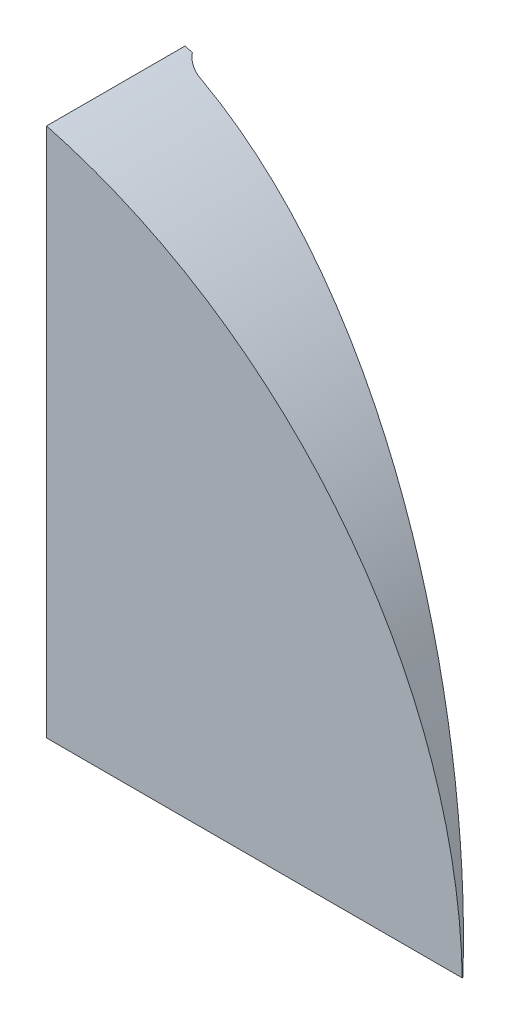
ISO-10303-21;
HEADER;
FILE_DESCRIPTION(('STEP AP214'),'2;1');
FILE_NAME('part.step','',(''),(''),'','','');
FILE_SCHEMA(('AUTOMOTIVE_DESIGN { 1 0 10303 214 1 1 1 1 }'));
ENDSEC;
DATA;
#1=APPLICATION_CONTEXT('core data for automotive mechanical design processes');
#2=APPLICATION_PROTOCOL_DEFINITION('international standard','automotive_design',2000,#1);
#3=PRODUCT_CONTEXT('',#1,'mechanical');
#4=PRODUCT('Part','Part','',(#3));
#5=PRODUCT_RELATED_PRODUCT_CATEGORY('part','',(#4));
#6=PRODUCT_DEFINITION_FORMATION('','',#4);
#7=PRODUCT_DEFINITION_CONTEXT('part definition',#1,'design');
#8=PRODUCT_DEFINITION('design','',#6,#7);
#9=PRODUCT_DEFINITION_SHAPE('','',#8);
#10=(LENGTH_UNIT() NAMED_UNIT(*) SI_UNIT(.MILLI.,.METRE.));
#11=(NAMED_UNIT(*) PLANE_ANGLE_UNIT() SI_UNIT($,.RADIAN.));
#12=(NAMED_UNIT(*) SI_UNIT($,.STERADIAN.) SOLID_ANGLE_UNIT());
#13=UNCERTAINTY_MEASURE_WITH_UNIT(LENGTH_MEASURE(1.E-05),#10,'distance_accuracy_value','');
#14=(GEOMETRIC_REPRESENTATION_CONTEXT(3) GLOBAL_UNCERTAINTY_ASSIGNED_CONTEXT((#13)) GLOBAL_UNIT_ASSIGNED_CONTEXT((#10,
#11,#12)) REPRESENTATION_CONTEXT('',''));
#15=CARTESIAN_POINT('',(0.,0.,0.));
#16=DIRECTION('',(0.,0.,1.));
#17=DIRECTION('',(1.,0.,0.));
#18=AXIS2_PLACEMENT_3D('',#15,#16,#17);
#19=CARTESIAN_POINT('',(7.5,0.,0.));
#20=DIRECTION('',(1.,0.,0.));
#21=DIRECTION('',(0.,0.,-1.));
#22=AXIS2_PLACEMENT_3D('',#19,#20,#21);
#23=PLANE('',#22);
#24=CARTESIAN_POINT('',(7.5,24.6269825229069,-24.4905503395669));
#25=CARTESIAN_POINT('',(7.49999999999999,25.4752306602531,-22.679342152337));
#26=CARTESIAN_POINT('',(9.49999999999999,25.4752306602531,-22.679342152337));
#27=CARTESIAN_POINT('',(7.5,23.727970498854,-24.0695135531755));
#28=CARTESIAN_POINT('',(7.49999999999999,24.5762186362002,-22.2583053659455));
#29=CARTESIAN_POINT('',(9.49999999999999,24.5762186362463,-22.258305365847));
#30=CARTESIAN_POINT('',(7.5,22.828958474801,-23.648476766784));
#31=CARTESIAN_POINT('',(7.49999999999999,23.6772066121472,-21.8372685795541));
#32=CARTESIAN_POINT('',(9.49999999999999,23.6772066122395,-21.837268579357));
#33=CARTESIAN_POINT('',(7.5,21.030934426695,-22.8064031940011));
#34=CARTESIAN_POINT('',(7.5,21.8791825640412,-20.9951950067712));
#35=CARTESIAN_POINT('',(9.49999999999999,21.8791825642258,-20.9951950063771));
#36=CARTESIAN_POINT('',(7.5,20.131922402642,-22.3853664076097));
#37=CARTESIAN_POINT('',(7.5,20.9801705399882,-20.5741582203798));
#38=CARTESIAN_POINT('',(9.49999999999999,20.980170540219,-20.5741582198871));
#39=CARTESIAN_POINT('',(7.5,19.2329103785891,-21.9643296212182));
#40=CARTESIAN_POINT('',(7.5,20.0811585159353,-20.1531214339883));
#41=CARTESIAN_POINT('',(9.49999999999999,20.0811585162121,-20.1531214333971));
#42=CARTESIAN_POINT('',(7.5,18.0490987270486,-21.409875517916));
#43=CARTESIAN_POINT('',(7.50000000000001,18.8757670199999,-19.5885584428168));
#44=CARTESIAN_POINT('',(9.49999999999999,18.8757670201004,-19.5885584426021));
#45=CARTESIAN_POINT('',(7.5,16.8553948942699,-20.8766633945285));
#46=CARTESIAN_POINT('',(7.5,17.6601045828467,-19.0455351028039));
#47=CARTESIAN_POINT('',(9.49999999999999,17.6601045828739,-19.0455351027459));
#48=CARTESIAN_POINT('',(7.5,14.4513778760624,-19.8547562465258));
#49=CARTESIAN_POINT('',(7.5,15.2115471749926,-18.0046953604924));
#50=CARTESIAN_POINT('',(9.49999999999999,15.2115471749654,-18.0046953605503));
#51=CARTESIAN_POINT('',(7.5,13.2410948578095,-19.3659902377444));
#52=CARTESIAN_POINT('',(7.49999999999999,13.9786834429632,-17.5068068781489));
#53=CARTESIAN_POINT('',(9.49999999999999,13.9786834429549,-17.5068068781666));
#54=CARTESIAN_POINT('',(7.5,10.3045322421882,-18.2423793633746));
#55=CARTESIAN_POINT('',(7.49999999999999,10.9870467312342,-16.3621233161698));
#56=CARTESIAN_POINT('',(9.49999999999999,10.9870467312459,-16.3621233161449));
#57=CARTESIAN_POINT('',(7.5,8.56973038793027,-17.6295832268934));
#58=CARTESIAN_POINT('',(7.5,9.21947567489382,-15.7377470520919));
#59=CARTESIAN_POINT('',(9.49999999999999,9.21947567489616,-15.7377470520869));
#60=CARTESIAN_POINT('',(7.5,5.9434789302502,-16.7784466367455));
#61=CARTESIAN_POINT('',(7.5,6.54345945029859,-14.8704819953038));
#62=CARTESIAN_POINT('',(9.49999999999999,6.54345945029742,-14.8704819953063));
#63=CARTESIAN_POINT('',(7.5,5.06299082120875,-16.5057934236718));
#64=CARTESIAN_POINT('',(7.5,5.64626099467511,-14.5926541618828));
#65=CARTESIAN_POINT('',(9.49999999999999,5.64626099467452,-14.592654161884));
#66=CARTESIAN_POINT('',(7.5,3.29517760896637,-15.9836900650106));
#67=CARTESIAN_POINT('',(7.5,3.84488052735341,-14.0606369472226));
#68=CARTESIAN_POINT('',(9.49999999999999,3.84488052735399,-14.0606369472213));
#69=CARTESIAN_POINT('',(7.5,2.4078526172603,-15.7342395419007));
#70=CARTESIAN_POINT('',(7.5,2.94069862953954,-13.8064471813771));
#71=CARTESIAN_POINT('',(9.49999999999999,2.94069862954071,-13.8064471813746));
#72=CARTESIAN_POINT('',(7.5,1.5173535307439,-15.4964767677445));
#73=CARTESIAN_POINT('',(7.49999999999999,2.03329148356876,-13.5641703663591));
#74=CARTESIAN_POINT('',(9.49999999999999,2.03329148356876,-13.5641703663591));
#75=(BOUNDED_SURFACE() B_SPLINE_SURFACE(3,2,((#24,#25,#26),(#27,#28,#29),(#30,#31,#32),(#33,#34,
#35),(#36,#37,#38),(#39,#40,#41),(#42,#43,#44),(#45,#46,#47),(#48,#49,#50),(#51,#52,#53),(#54,
#55,#56),(#57,#58,#59),(#60,#61,#62),(#63,#64,#65),(#66,#67,#68),(#69,#70,#71),(#72,#73,#74)),
.UNSPECIFIED.,.F.,.F.,.F.) B_SPLINE_SURFACE_WITH_KNOTS((4,2,3,2,2,2,2,4),(3,3),(0.,
2.97816241229051,5.95632482458102,9.87766521898863,13.7926286789041,19.3093322650314,
22.0742767603028,24.8391762603108),(0.,1.),
.UNSPECIFIED.) GEOMETRIC_REPRESENTATION_ITEM() RATIONAL_B_SPLINE_SURFACE(((1.,0.707106781186547,
1.),(1.,0.707106781186547,1.),(1.,0.707106781186547,1.),(1.,0.707106781186548,1.),(1.,
0.707106781186548,1.),(1.,0.707106781186548,1.),(1.,0.70710678118655,1.),(1.,0.707106781186549,
1.),(1.,0.707106781186548,1.),(1.,0.707106781186547,1.),(1.,0.707106781186546,1.),(1.,
0.707106781186548,1.),(1.,0.707106781186549,1.),(1.,0.707106781186549,1.),(1.,0.707106781186548,
1.),(1.,0.707106781186548,1.),(1.,0.707106781186547,1.))) REPRESENTATION_ITEM('') SURFACE());
#76=CARTESIAN_POINT('',(7.5,24.6269825229069,-24.4905503395669));
#77=CARTESIAN_POINT('',(7.5,23.727970498854,-24.0695135531755));
#78=CARTESIAN_POINT('',(7.5,22.828958474801,-23.648476766784));
#79=CARTESIAN_POINT('',(7.5,21.030934426695,-22.8064031940011));
#80=CARTESIAN_POINT('',(7.5,20.131922402642,-22.3853664076097));
#81=CARTESIAN_POINT('',(7.5,19.2329103785891,-21.9643296212182));
#82=CARTESIAN_POINT('',(7.5,18.0490987270486,-21.409875517916));
#83=CARTESIAN_POINT('',(7.5,16.8553948942699,-20.8766633945285));
#84=CARTESIAN_POINT('',(7.5,14.4513778760624,-19.8547562465258));
#85=CARTESIAN_POINT('',(7.5,13.2410948578095,-19.3659902377444));
#86=CARTESIAN_POINT('',(7.5,10.3045322421882,-18.2423793633746));
#87=CARTESIAN_POINT('',(7.5,8.56973038793027,-17.6295832268934));
#88=CARTESIAN_POINT('',(7.5,5.9434789302502,-16.7784466367455));
#89=CARTESIAN_POINT('',(7.5,5.06299082120875,-16.5057934236718));
#90=CARTESIAN_POINT('',(7.5,3.29517760896637,-15.9836900650106));
#91=CARTESIAN_POINT('',(7.5,2.4078526172603,-15.7342395419007));
#92=CARTESIAN_POINT('',(7.5,1.5173535307439,-15.4964767677445));
#93=B_SPLINE_CURVE_WITH_KNOTS('',3,(#76,#77,#78,#79,#80,#81,#82,#83,#84,#85,#86,#87,#88,#89,#90,
#91,#92),.UNSPECIFIED.,.F.,.F.,(4,2,3,2,2,2,2,4),(0.,2.97816241229051,5.95632482458102,
9.87766521898863,13.7926286789041,19.3093322650314,22.0742767603028,24.8391762603108),.UNSPECIFIED.);
#94=CARTESIAN_POINT('',(7.5,15.1653512938994,-20.1596586906036));
#95=VERTEX_POINT('',#94);
#96=CARTESIAN_POINT('',(7.5,5.6275464071145,-16.6838640231835));
#97=VERTEX_POINT('',#96);
#98=EDGE_CURVE('E11',#95,#97,#93,.T.);
#99=ORIENTED_EDGE('',*,*,#98,.T.);
#100=CARTESIAN_POINT('',(7.5,-20.4999999999999,0.));
#101=DIRECTION('',(1.,0.,0.));
#102=DIRECTION('',(0.,0.,-1.));
#103=AXIS2_PLACEMENT_3D('',#100,#101,#102);
#104=CIRCLE('',#103,30.9999999999999);
#105=CARTESIAN_POINT('',(7.50000000000001,6.20385889532149,-15.7449649125922));
#106=VERTEX_POINT('',#105);
#107=EDGE_CURVE('E227',#106,#97,#104,.F.);
#108=ORIENTED_EDGE('',*,*,#107,.F.);
#109=CARTESIAN_POINT('',(7.50000000000002,-20.9157926242046,-10.));
#110=CARTESIAN_POINT('',(7.50000000000002,0.108501165267456,-13.0562085018914));
#111=CARTESIAN_POINT('',(7.50000000000001,20.0842073757953,-20.1531214173485));
#112=B_SPLINE_CURVE_WITH_KNOTS('',2,(#109,#110,#111),.UNSPECIFIED.,.F.,.F.,(3,3),(0.,1.),.UNSPECIFIED.);
#113=CARTESIAN_POINT('',(7.49999999999999,-20.1657926242046,-10.1103593750755));
#114=VERTEX_POINT('',#113);
#115=EDGE_CURVE('E47',#106,#114,#112,.F.);
#116=ORIENTED_EDGE('',*,*,#115,.T.);
#117=DIRECTION('',(0.,0.,-1.));
#118=VECTOR('',#117,1.);
#119=CARTESIAN_POINT('',(7.5,-20.1657926242046,-24.));
#120=LINE('',#119,#118);
#121=CARTESIAN_POINT('',(7.5,-20.1657926242046,-10.));
#122=VERTEX_POINT('',#121);
#123=EDGE_CURVE('E130',#122,#114,#120,.T.);
#124=ORIENTED_EDGE('',*,*,#123,.F.);
#125=DIRECTION('',(0.,-1.,0.));
#126=VECTOR('',#125,1.);
#127=CARTESIAN_POINT('',(7.5,0.,-10.));
#128=LINE('',#127,#126);
#129=CARTESIAN_POINT('',(7.5,18.716895904332,-10.));
#130=VERTEX_POINT('',#129);
#131=EDGE_CURVE('E234',#130,#122,#128,.T.);
#132=ORIENTED_EDGE('',*,*,#131,.F.);
#133=DIRECTION('',(0.,0.,-1.));
#134=VECTOR('',#133,1.);
#135=CARTESIAN_POINT('',(7.5,18.716895904332,0.));
#136=LINE('',#135,#134);
#137=CARTESIAN_POINT('',(7.5,18.7168959043316,-20.1531214173485));
#138=VERTEX_POINT('',#137);
#139=EDGE_CURVE('E233',#138,#130,#136,.F.);
#140=ORIENTED_EDGE('',*,*,#139,.F.);
#141=DIRECTION('',(0.,-1.,0.));
#142=VECTOR('',#141,1.);
#143=CARTESIAN_POINT('',(7.5,-20.9157926242048,-20.1531214173485));
#144=LINE('',#143,#142);
#145=CARTESIAN_POINT('',(7.5,15.2050654268776,-20.1531214173485));
#146=VERTEX_POINT('',#145);
#147=EDGE_CURVE('E226',#138,#146,#144,.T.);
#148=ORIENTED_EDGE('',*,*,#147,.T.);
#149=CARTESIAN_POINT('',(7.5,12.8789441662329,-19.7809526147633));
#150=CARTESIAN_POINT('',(7.5,13.248858139662,-19.9729817315801));
#151=CARTESIAN_POINT('',(7.5,13.983479697962,-20.3543372335831));
#152=CARTESIAN_POINT('',(7.5,14.799798647885,-20.219875705482));
#153=CARTESIAN_POINT('',(7.5,15.2050654268776,-20.1531214173485));
#154=B_SPLINE_CURVE_WITH_KNOTS('',3,(#149,#150,#151,#152,#153),.UNSPECIFIED.,.F.,.F.,(4,1,4),
(0.,0.503543585468801,1.),.UNSPECIFIED.);
#155=EDGE_CURVE('E40',#95,#146,#154,.T.);
#156=ORIENTED_EDGE('',*,*,#155,.F.);
#157=EDGE_LOOP('',(#99,#108,#116,#124,#132,#140,#148,#156));
#158=FACE_BOUND('',#157,.T.);
#159=ADVANCED_FACE('F37',(#158),#23,.F.);
#160=CARTESIAN_POINT('',(7.55577683371129,6.63099621654525,-16.5088194571331));
#161=CARTESIAN_POINT('',(7.57033259388141,6.62541728951922,-16.4436923329377));
#162=CARTESIAN_POINT('',(7.58760420781254,6.61878697766647,-16.3793160570922));
#163=CARTESIAN_POINT('',(7.62730942988323,6.60348721486283,-16.2524364228923));
#164=CARTESIAN_POINT('',(7.64974202537131,6.59481816393156,-16.1899326998345));
#165=CARTESIAN_POINT('',(7.72406400789847,6.56596980605252,-16.0065462460896));
#166=CARTESIAN_POINT('',(7.78317389278291,6.54287507883383,-15.8889335726621));
#167=CARTESIAN_POINT('',(7.89136617376938,6.50007972206728,-15.7098338432503));
#168=CARTESIAN_POINT('',(7.93519865452009,6.48263698099535,-15.6445158070028));
#169=CARTESIAN_POINT('',(8.02844768451344,6.44523576200538,-15.5186718472794));
#170=CARTESIAN_POINT('',(8.07786891760349,6.42527517227525,-15.4581500167587));
#171=CARTESIAN_POINT('',(8.22251761956444,6.36634584677148,-15.2969965263947));
#172=CARTESIAN_POINT('',(8.32325511981062,6.32475331792333,-15.2021620784517));
#173=CARTESIAN_POINT('',(8.5374777924491,6.23471668099388,-15.0319218828541));
#174=CARTESIAN_POINT('',(8.65098167545028,6.18626248870625,-14.956545199853));
#175=CARTESIAN_POINT('',(8.88434164094845,6.08472683047693,-14.8290982172099));
#176=CARTESIAN_POINT('',(9.00396762176808,6.0317915393513,-14.7764917891057));
#177=CARTESIAN_POINT('',(9.24869404880921,5.92145751977753,-14.6937226056227));
#178=CARTESIAN_POINT('',(9.37379173053608,5.86406103414679,-14.6635486521445));
#179=CARTESIAN_POINT('',(9.50000000000017,5.80498580756965,-14.645475676483));
#180=B_SPLINE_CURVE_WITH_KNOTS('',3,(#160,#161,#162,#163,#164,#165,#166,#167,#168,#169,#170,
#171,#172,#173,#174,#175,#176,#177,#178,#179),.UNSPECIFIED.,.F.,.F.,(4,2,2,2,2,2,2,2,2,4),(0.,
0.200735949554099,0.401432545653739,0.800219610235882,1.04161468337998,1.28321358671339,
1.71441641454558,2.14625966394889,2.5672940261324,2.98811807017762),.UNSPECIFIED.);
#181=CARTESIAN_POINT('',(7.81581267110756,6.52993921634731,-15.8367277986006));
#182=VERTEX_POINT('',#181);
#183=CARTESIAN_POINT('',(9.49999999999999,5.80498580756934,-14.6454756764829));
#184=VERTEX_POINT('',#183);
#185=EDGE_CURVE('E270',#182,#184,#180,.T.);
#186=ORIENTED_EDGE('',*,*,#185,.F.);
#187=CARTESIAN_POINT('',(7.88800905507462,9.15123534657457,-16.5947206449579));
#188=CARTESIAN_POINT('',(7.87742605412391,8.84333332329652,-16.5035537575234));
#189=CARTESIAN_POINT('',(7.8676533417578,8.53520124763731,-16.4130725441961));
#190=CARTESIAN_POINT('',(7.84957119367692,7.91850450895763,-16.2334905747529));
#191=CARTESIAN_POINT('',(7.84126170364208,7.60993986242458,-16.1443897675035));
#192=CARTESIAN_POINT('',(7.82594796686264,6.99238382767379,-15.9675712905813));
#193=CARTESIAN_POINT('',(7.81894371506109,6.68339244111406,-15.8798536155511));
#194=CARTESIAN_POINT('',(7.80611691675525,6.06498316324514,-15.7058022591459));
#195=CARTESIAN_POINT('',(7.80029441412344,5.75556525653055,-15.6194686292632));
#196=CARTESIAN_POINT('',(7.79500129009292,5.44594627465571,-15.5338308827929));
#197=B_SPLINE_CURVE_WITH_KNOTS('',3,(#187,#188,#189,#190,#191,#192,#193,#194,#195,#196),
.UNSPECIFIED.,.F.,.F.,(4,2,2,2,4),(0.,0.963866066756547,1.92769634379308,2.89152288652779,
3.85538520480947),.UNSPECIFIED.);
#198=CARTESIAN_POINT('',(7.80905726544879,6.2038588953215,-15.7449649125922));
#199=VERTEX_POINT('',#198);
#200=EDGE_CURVE('E116',#182,#199,#197,.T.);
#201=ORIENTED_EDGE('',*,*,#200,.T.);
#202=CARTESIAN_POINT('',(7.5,5.6275464071145,-16.6838640231835));
#203=CARTESIAN_POINT('',(7.50000187348262,5.65933827283921,-16.634078405932));
#204=CARTESIAN_POINT('',(7.5024368850069,5.69097177755135,-16.5842234084507));
#205=CARTESIAN_POINT('',(7.51218345221658,5.75374433492373,-16.4846706141856));
#206=CARTESIAN_POINT('',(7.51949564005495,5.78488332295169,-16.4349728386192));
#207=CARTESIAN_POINT('',(7.54878208481883,5.87734156263239,-16.2864791889875));
#208=CARTESIAN_POINT('',(7.57810626925494,5.9376372916024,-16.1883845352388));
#209=CARTESIAN_POINT('',(7.65582389439488,6.05380462894296,-15.9971259209356));
#210=CARTESIAN_POINT('',(7.70424435167401,6.10966983412079,-15.9039691590394));
#211=CARTESIAN_POINT('',(7.81897214816388,6.21533549024928,-15.7258238771904));
#212=CARTESIAN_POINT('',(7.88523339336739,6.26515109647458,-15.6408150628774));
#213=CARTESIAN_POINT('',(7.98589331187303,6.327719777602,-15.5330144096295));
#214=CARTESIAN_POINT('',(8.01334543225031,6.3436883332864,-15.5053979081086));
#215=CARTESIAN_POINT('',(8.07016086539517,6.37464184627612,-15.4516853323887));
#216=CARTESIAN_POINT('',(8.09952224763529,6.3896277672818,-15.4255877714289));
#217=CARTESIAN_POINT('',(8.12981136386017,6.40411401920969,-15.4002808039777));
#218=B_SPLINE_CURVE_WITH_KNOTS('',3,(#202,#203,#204,#205,#206,#207,#208,#209,#210,#211,#212,
#213,#214,#215,#216,#217),.UNSPECIFIED.,.F.,.F.,(4,2,2,2,2,2,2,4),(0.,0.177106680635311,
0.354236321333857,0.708852491239717,1.06397216680997,1.41818300504829,1.54438061168844,
1.67045254176131),.UNSPECIFIED.);
#219=EDGE_CURVE('E264',#97,#199,#218,.T.);
#220=ORIENTED_EDGE('',*,*,#219,.F.);
#221=ORIENTED_EDGE('',*,*,#98,.F.);
#222=CARTESIAN_POINT('',(7.50011440081169,15.2050654268776,-20.1531214173485));
#223=CARTESIAN_POINT('',(7.50007626586917,15.1984466311255,-20.1542120045492));
#224=CARTESIAN_POINT('',(7.50004766499693,15.1918277221766,-20.1553020709194));
#225=CARTESIAN_POINT('',(7.50000953139293,15.1785896778505,-20.1574811620045));
#226=CARTESIAN_POINT('',(7.49999999866127,15.1719705424734,-20.1585701867193));
#227=CARTESIAN_POINT('',(7.49999999999999,15.1653512938994,-20.1596586906036));
#228=B_SPLINE_CURVE_WITH_KNOTS('',3,(#222,#223,#224,#225,#226,#227),.UNSPECIFIED.,.F.,.F.,(4,2,
4),(0.,0.0201243922984543,0.040248784701385),.UNSPECIFIED.);
#229=CARTESIAN_POINT('',(7.50011440081169,15.2050654268776,-20.1531214173485));
#230=VERTEX_POINT('',#229);
#231=EDGE_CURVE('E212',#230,#95,#228,.T.);
#232=ORIENTED_EDGE('',*,*,#231,.F.);
#233=CARTESIAN_POINT('',(8.04049506676899,18.5697423054458,-20.1531214173485));
#234=CARTESIAN_POINT('',(8.01994712600048,18.5166378824148,-20.1531214173485));
#235=CARTESIAN_POINT('',(8.00023179985125,18.4632182982716,-20.1531214173485));
#236=CARTESIAN_POINT('',(7.96234803967043,18.3558415116817,-20.1531214173485));
#237=CARTESIAN_POINT('',(7.94417937888747,18.3018843893418,-20.1531214173485));
#238=CARTESIAN_POINT('',(7.89183260475811,18.1394007782811,-20.1531214173485));
#239=CARTESIAN_POINT('',(7.85978425220841,18.0301847821005,-20.1531214173485));
#240=CARTESIAN_POINT('',(7.80073350185788,17.8106481608989,-20.1531214173485));
#241=CARTESIAN_POINT('',(7.77372113792452,17.7003301827571,-20.1531214173485));
#242=CARTESIAN_POINT('',(7.72412978006257,17.4786877007268,-20.1531214173485));
#243=CARTESIAN_POINT('',(7.70155166848497,17.3673630011162,-20.1531214173485));
#244=CARTESIAN_POINT('',(7.6402617326359,17.0345953023698,-20.1531214173485));
#245=CARTESIAN_POINT('',(7.60740005949277,16.8120648839304,-20.1531214173485));
#246=CARTESIAN_POINT('',(7.55514760749223,16.365401302421,-20.1531214173485));
#247=CARTESIAN_POINT('',(7.53576124614401,16.1412676380752,-20.1531214173485));
#248=CARTESIAN_POINT('',(7.51893972506301,15.8576386945725,-20.1531214173485));
#249=CARTESIAN_POINT('',(7.51585244406013,15.7984432962667,-20.1531214173485));
#250=CARTESIAN_POINT('',(7.51050773003182,15.6800277782039,-20.1531214173485));
#251=CARTESIAN_POINT('',(7.50825010070863,15.620807667618,-20.1531214173485));
#252=CARTESIAN_POINT('',(7.50454248902379,15.5021817119311,-20.1531214173485));
#253=CARTESIAN_POINT('',(7.50309471536343,15.4427757989695,-20.1531214173485));
#254=CARTESIAN_POINT('',(7.50100379397948,15.3239356141455,-20.1531214173485));
#255=CARTESIAN_POINT('',(7.5003608382332,15.2645013388988,-20.1531214173485));
#256=CARTESIAN_POINT('',(7.50011440081169,15.2050654268776,-20.1531214173485));
#257=B_SPLINE_CURVE_WITH_KNOTS('',3,(#233,#234,#235,#236,#237,#238,#239,#240,#241,#242,#243,
#244,#245,#246,#247,#248,#249,#250,#251,#252,#253,#254,#255,#256),.UNSPECIFIED.,.F.,.F.,(4,2,2,
2,2,2,2,2,2,2,2,4),(0.,0.170806003228662,0.341586921887336,0.68290104085217,1.02353236386615,
1.36423139898102,2.0385387106415,2.71306697122831,2.89089189333217,3.06867471445999,
3.24694006379429,3.4252479275707),.UNSPECIFIED.);
#258=CARTESIAN_POINT('',(8.0404950667689,18.5697423054455,-20.1531214173485));
#259=VERTEX_POINT('',#258);
#260=EDGE_CURVE('E243',#259,#230,#257,.T.);
#261=ORIENTED_EDGE('',*,*,#260,.F.);
#262=CARTESIAN_POINT('',(9.49999999999999,18.132254702139,-19.2631441569409));
#263=CARTESIAN_POINT('',(9.43950042789879,18.1516231315075,-19.2717493775103));
#264=CARTESIAN_POINT('',(9.37934998613328,18.1707220133504,-19.283261495485));
#265=CARTESIAN_POINT('',(9.26019995108919,18.2082583859044,-19.3117989846479));
#266=CARTESIAN_POINT('',(9.2011996832704,18.2266962699401,-19.3288210145995));
#267=CARTESIAN_POINT('',(9.08487580355155,18.2627663390821,-19.368039194384));
#268=CARTESIAN_POINT('',(9.02754832432989,18.2804004461577,-19.3902221331441));
#269=CARTESIAN_POINT('',(8.91478902407236,18.3148240218611,-19.4394940652374));
#270=CARTESIAN_POINT('',(8.85935744216517,18.3316133840667,-19.4665836747539));
#271=CARTESIAN_POINT('',(8.6966453203524,18.3805336591655,-19.5546031572));
#272=CARTESIAN_POINT('',(8.5925982739253,18.4113246644565,-19.6224037274764));
#273=CARTESIAN_POINT('',(8.39569179585241,18.4688333007094,-19.7739258704215));
#274=CARTESIAN_POINT('',(8.30282723254306,18.4955528015985,-19.8576400944521));
#275=CARTESIAN_POINT('',(8.18539503721845,18.5289533494628,-19.9805530287127));
#276=CARTESIAN_POINT('',(8.15514375349753,18.5375177634184,-20.0139658750249));
#277=CARTESIAN_POINT('',(8.09645977947484,18.554063043695,-20.0823683574715));
#278=CARTESIAN_POINT('',(8.0680235242475,18.5620450586267,-20.1173546572092));
#279=CARTESIAN_POINT('',(8.04049506676899,18.5697423054458,-20.1531214173485));
#280=B_SPLINE_CURVE_WITH_KNOTS('',3,(#262,#263,#264,#265,#266,#267,#268,#269,#270,#271,#272,
#273,#274,#275,#276,#277,#278,#279),.UNSPECIFIED.,.F.,.F.,(4,2,2,2,2,2,2,2,4),(0.,
0.192215544037456,0.384314745347083,0.575927512308526,0.767564358840175,1.14969794953648,
1.53165550462567,1.6692428942272,1.80655115639835),.UNSPECIFIED.);
#281=CARTESIAN_POINT('',(9.50000000000251,18.1322547021334,-19.2631441569384));
#282=VERTEX_POINT('',#281);
#283=EDGE_CURVE('E279',#282,#259,#280,.T.);
#284=ORIENTED_EDGE('',*,*,#283,.F.);
#285=CARTESIAN_POINT('',(9.49999999999999,2.03329148356876,-13.5641703663591));
#286=CARTESIAN_POINT('',(9.49999999999999,2.94069862954071,-13.8064471813746));
#287=CARTESIAN_POINT('',(9.49999999999999,3.84488052735399,-14.0606369472213));
#288=CARTESIAN_POINT('',(9.49999999999999,5.64626099467452,-14.592654161884));
#289=CARTESIAN_POINT('',(9.49999999999999,6.54345945029742,-14.8704819953063));
#290=CARTESIAN_POINT('',(9.49999999999999,9.21947567489616,-15.7377470520869));
#291=CARTESIAN_POINT('',(9.49999999999999,10.9870467312459,-16.3621233161449));
#292=CARTESIAN_POINT('',(9.49999999999999,13.9786834429549,-17.5068068781666));
#293=CARTESIAN_POINT('',(9.49999999999999,15.2115471749654,-18.0046953605503));
#294=CARTESIAN_POINT('',(9.49999999999999,17.6601045828739,-19.0455351027459));
#295=CARTESIAN_POINT('',(9.49999999999999,18.8757670201004,-19.5885584426021));
#296=CARTESIAN_POINT('',(9.49999999999999,20.0811585162121,-20.1531214333971));
#297=CARTESIAN_POINT('',(9.49999999999999,20.980170540219,-20.5741582198871));
#298=CARTESIAN_POINT('',(9.49999999999999,21.8791825642258,-20.9951950063771));
#299=CARTESIAN_POINT('',(9.49999999999999,23.6772066122395,-21.837268579357));
#300=CARTESIAN_POINT('',(9.49999999999999,24.5762186362463,-22.258305365847));
#301=CARTESIAN_POINT('',(9.49999999999999,25.4752306602531,-22.679342152337));
#302=B_SPLINE_CURVE_WITH_KNOTS('',3,(#285,#286,#287,#288,#289,#290,#291,#292,#293,#294,#295,
#296,#297,#298,#299,#300,#301),.UNSPECIFIED.,.F.,.F.,(4,2,2,2,2,3,2,4),(0.,2.764899500008,
5.5298439952794,11.0465475814067,14.9615110413222,18.8828514357298,21.8610138480203,
24.8391762603108),.UNSPECIFIED.);
#303=EDGE_CURVE('E271',#184,#282,#302,.T.);
#304=ORIENTED_EDGE('',*,*,#303,.F.);
#305=EDGE_LOOP('',(#186,#201,#220,#221,#232,#261,#284,#304));
#306=FACE_BOUND('',#305,.T.);
#307=ADVANCED_FACE('F145',(#306),#75,.F.);
#308=CARTESIAN_POINT('',(0.,0.,-10.));
#309=DIRECTION('',(0.,0.,-1.));
#310=DIRECTION('',(-1.,0.,0.));
#311=AXIS2_PLACEMENT_3D('',#308,#309,#310);
#312=PLANE('',#311);
#313=CARTESIAN_POINT('',(-3.00000000000002,-20.9157926242046,-10.));
#314=DIRECTION('',(0.,0.,1.));
#315=DIRECTION('',(1.,0.,0.));
#316=AXIS2_PLACEMENT_3D('',#313,#314,#315);
#317=CIRCLE('',#316,41.);
#318=CARTESIAN_POINT('',(37.9931396699498,-20.1657926242046,-10.));
#319=VERTEX_POINT('',#318);
#320=EDGE_CURVE('E219',#319,#130,#317,.T.);
#321=ORIENTED_EDGE('',*,*,#320,.T.);
#322=ORIENTED_EDGE('',*,*,#131,.T.);
#323=DIRECTION('',(-1.,0.,0.));
#324=VECTOR('',#323,1.);
#325=CARTESIAN_POINT('',(-44.,-20.1657926242046,-10.));
#326=LINE('',#325,#324);
#327=EDGE_CURVE('E218',#319,#122,#326,.T.);
#328=ORIENTED_EDGE('',*,*,#327,.F.);
#329=EDGE_LOOP('',(#321,#322,#328));
#330=FACE_BOUND('',#329,.T.);
#331=ADVANCED_FACE('F158',(#330),#312,.F.);
#332=CARTESIAN_POINT('',(-3.00000000000002,-20.9157926242046,0.));
#333=DIRECTION('',(0.,0.,-1.));
#334=DIRECTION('',(-1.,0.,0.));
#335=AXIS2_PLACEMENT_3D('',#332,#333,#334);
#336=CYLINDRICAL_SURFACE('',#335,41.);
#337=CARTESIAN_POINT('',(-3.00000000000014,-20.9157926242048,-20.1531214173485));
#338=DIRECTION('',(0.,0.,-1.));
#339=DIRECTION('',(-1.,0.,0.));
#340=AXIS2_PLACEMENT_3D('',#337,#338,#339);
#341=CIRCLE('',#340,40.9999999999998);
#342=EDGE_CURVE('E168',#138,#259,#341,.T.);
#343=ORIENTED_EDGE('',*,*,#342,.F.);
#344=ORIENTED_EDGE('',*,*,#139,.T.);
#345=ORIENTED_EDGE('',*,*,#320,.F.);
#346=DIRECTION('',(0.,0.,1.));
#347=VECTOR('',#346,1.);
#348=CARTESIAN_POINT('',(37.9931396699498,-20.1657926242046,-10.0399141139674));
#349=LINE('',#348,#347);
#350=CARTESIAN_POINT('',(37.9931396699498,-20.1657926242046,-10.0399141139674));
#351=VERTEX_POINT('',#350);
#352=EDGE_CURVE('E291',#351,#319,#349,.T.);
#353=ORIENTED_EDGE('',*,*,#352,.F.);
#354=CARTESIAN_POINT('',(7.49999999999959,18.7168959043338,-19.5253640146458));
#355=CARTESIAN_POINT('',(8.05905859911408,18.5687918384543,-19.4584299281652));
#356=CARTESIAN_POINT('',(8.61440926213877,18.40899321433,-19.3865873145693));
#357=CARTESIAN_POINT('',(9.71668215724056,18.0664965073405,-19.2337287085065));
#358=CARTESIAN_POINT('',(10.2636049843622,17.8838000495649,-19.1527133670795));
#359=CARTESIAN_POINT('',(11.3477960864091,17.4960810200852,-18.982189411121));
#360=CARTESIAN_POINT('',(11.8850694209471,17.2910705717654,-18.8926854119179));
#361=CARTESIAN_POINT('',(12.9493325928658,16.8591818283985,-18.705858088666));
#362=CARTESIAN_POINT('',(13.476322260822,16.6323031734352,-18.6085346359258));
#363=CARTESIAN_POINT('',(15.0378763908757,15.9208831267647,-18.3064480493005));
#364=CARTESIAN_POINT('',(16.0560979519725,15.4044563849507,-18.0910788164902));
#365=CARTESIAN_POINT('',(18.0422480097381,14.2910347175806,-17.6382527614746));
#366=CARTESIAN_POINT('',(19.0101699248327,13.6940292850984,-17.4007930600758));
#367=CARTESIAN_POINT('',(20.8886834166446,12.4250680761058,-16.9106268712747));
#368=CARTESIAN_POINT('',(21.7993801816428,11.753256507628,-16.6579501362128));
#369=CARTESIAN_POINT('',(23.5605803331259,10.3381936531032,-16.1433478959539));
#370=CARTESIAN_POINT('',(24.4110856559552,9.59494466699653,-15.8814226886847));
#371=CARTESIAN_POINT('',(26.0481412890883,8.04073581827492,-15.3544065031198));
#372=CARTESIAN_POINT('',(26.8346368330483,7.2297191516946,-15.0893130318944));
#373=CARTESIAN_POINT('',(28.3385927897637,5.54488551916604,-14.5623068584502));
#374=CARTESIAN_POINT('',(29.0560512363967,4.67106676590106,-14.3003942470053));
#375=CARTESIAN_POINT('',(30.2110941354966,3.1392345304235,-13.8637287902076));
#376=CARTESIAN_POINT('',(30.6676077563762,2.49606358403129,-13.6866140917671));
#377=CARTESIAN_POINT('',(31.5435502453831,1.18320618095486,-13.3386987900338));
#378=CARTESIAN_POINT('',(31.9629777345089,0.513518739627375,-13.1678984216688));
#379=CARTESIAN_POINT('',(32.7632556147354,-0.8505270383478,-12.8344404449951));
#380=CARTESIAN_POINT('',(33.1441040238095,-1.54488664007162,-12.6717832552647));
#381=CARTESIAN_POINT('',(33.865416863623,-2.95561423560265,-12.3564760954034));
#382=CARTESIAN_POINT('',(34.2059199534181,-3.67196031928222,-12.2038166092213));
#383=CARTESIAN_POINT('',(34.8455491613424,-5.12514319085298,-11.9099119388273));
#384=CARTESIAN_POINT('',(35.1446770007987,-5.86197912477596,-11.7686662798697));
#385=CARTESIAN_POINT('',(35.7002006917872,-7.35379279528276,-11.4990163212285));
#386=CARTESIAN_POINT('',(35.9566026191659,-8.10876793487633,-11.3706101967368));
#387=CARTESIAN_POINT('',(36.389200919971,-9.51640739294461,-11.1466399205825));
#388=CARTESIAN_POINT('',(36.5716688436318,-10.1668332960741,-11.0490680255011));
#389=CARTESIAN_POINT('',(36.9045277016928,-11.4772760649721,-10.8646125701235));
#390=CARTESIAN_POINT('',(37.0549222226127,-12.137291849553,-10.7777278152277));
#391=CARTESIAN_POINT('',(37.3230444934532,-13.4652309923316,-10.6151704140922));
#392=CARTESIAN_POINT('',(37.4407751274816,-14.1331536469466,-10.5394967782248));
#393=CARTESIAN_POINT('',(37.6432886153552,-15.4765410412121,-10.3996163911124));
#394=CARTESIAN_POINT('',(37.7280056381664,-16.1520181151307,-10.3354326877627));
#395=CARTESIAN_POINT('',(37.8637625488331,-17.5074582198792,-10.218998081787));
#396=CARTESIAN_POINT('',(37.9147982869702,-18.1874217930509,-10.1667486500468));
#397=CARTESIAN_POINT('',(37.9829337062002,-19.5500830039525,-10.0742982680137));
#398=CARTESIAN_POINT('',(38.0000224494826,-20.2327814518952,-10.0341012045661));
#399=CARTESIAN_POINT('',(38.,-20.9157926242048,-10.));
#400=B_SPLINE_CURVE_WITH_KNOTS('',3,(#354,#355,#356,#357,#358,#359,#360,#361,#362,#363,#364,
#365,#366,#367,#368,#369,#370,#371,#372,#373,#374,#375,#376,#377,#378,#379,#380,#381,#382,#383,
#384,#385,#386,#387,#388,#389,#390,#391,#392,#393,#394,#395,#396,#397,#398,#399),.UNSPECIFIED.,
.F.,.F.,(4,2,2,2,2,2,2,2,2,2,2,2,2,2,2,2,2,2,2,2,2,2,4),(0.,1.74642891580064,3.49273395532985,
5.23809490401711,6.98348458349417,10.4643972912878,13.9457643262684,17.4205326706821,
20.8951891817578,24.3727879983384,27.8504858249051,30.2743624332611,32.6983291325646,
35.1224203017208,37.5441695833842,39.9658180831284,42.3871219174587,44.4338912495253,
46.480431587115,48.5267911647454,50.5772106720171,52.6278827550444,54.6792154628747),.UNSPECIFIED.);
#401=EDGE_CURVE('E170',#282,#351,#400,.T.);
#402=ORIENTED_EDGE('',*,*,#401,.F.);
#403=ORIENTED_EDGE('',*,*,#283,.T.);
#404=EDGE_LOOP('',(#343,#344,#345,#353,#402,#403));
#405=FACE_BOUND('',#404,.T.);
#406=ADVANCED_FACE('F184',(#405),#336,.T.);
#407=CARTESIAN_POINT('',(-44.,-20.1657926242046,-24.));
#408=DIRECTION('',(0.,1.,0.));
#409=DIRECTION('',(0.,0.,1.));
#410=AXIS2_PLACEMENT_3D('',#407,#408,#409);
#411=PLANE('',#410);
#412=ORIENTED_EDGE('',*,*,#327,.T.);
#413=ORIENTED_EDGE('',*,*,#123,.T.);
#414=DIRECTION('',(1.,0.,0.));
#415=VECTOR('',#414,1.);
#416=CARTESIAN_POINT('',(-122.5,-20.1657926242047,-10.1103593750755));
#417=LINE('',#416,#415);
#418=CARTESIAN_POINT('',(26.4904645605996,-20.1657926242046,-10.1103593750755));
#419=VERTEX_POINT('',#418);
#420=EDGE_CURVE('E114',#419,#114,#417,.F.);
#421=ORIENTED_EDGE('',*,*,#420,.F.);
#422=DIRECTION('',(0.,0.,1.));
#423=VECTOR('',#422,1.);
#424=CARTESIAN_POINT('',(26.4904645605996,-20.1657926242046,-40.9745498689574));
#425=LINE('',#424,#423);
#426=CARTESIAN_POINT('',(26.4904645605996,-20.1657926242046,-10.0399141139674));
#427=VERTEX_POINT('',#426);
#428=EDGE_CURVE('E120',#419,#427,#425,.T.);
#429=ORIENTED_EDGE('',*,*,#428,.T.);
#430=DIRECTION('',(-1.,0.,0.));
#431=VECTOR('',#430,1.);
#432=CARTESIAN_POINT('',(22.8415,-20.1657926242046,-10.0399141139674));
#433=LINE('',#432,#431);
#434=EDGE_CURVE('E247',#427,#351,#433,.F.);
#435=ORIENTED_EDGE('',*,*,#434,.T.);
#436=ORIENTED_EDGE('',*,*,#352,.T.);
#437=EDGE_LOOP('',(#412,#413,#421,#429,#435,#436));
#438=FACE_BOUND('',#437,.T.);
#439=ADVANCED_FACE('F129',(#438),#411,.F.);
#440=CARTESIAN_POINT('',(127.5,20.0811584819447,-20.1531214173485));
#441=CARTESIAN_POINT('',(127.5,0.708855468263326,-11.0804371929064));
#442=CARTESIAN_POINT('',(127.5,-20.9157926242048,-10.));
#443=B_SPLINE_CURVE_WITH_KNOTS('',2,(#440,#441,#442),.UNSPECIFIED.,.F.,.F.,(3,3),(0.,1.),.UNSPECIFIED.);
#444=DIRECTION('',(-1.,0.,0.));
#445=VECTOR('',#444,1.);
#446=SURFACE_OF_LINEAR_EXTRUSION('',#443,#445);
#447=CARTESIAN_POINT('',(26.4999999999997,-20.9157926242048,-10.));
#448=CARTESIAN_POINT('',(26.500020736493,-20.367794965209,-10.0273613231697));
#449=CARTESIAN_POINT('',(26.484731291163,-19.8200011701386,-10.0586521142012));
#450=CARTESIAN_POINT('',(26.423754126946,-18.7267178843085,-10.1289403147088));
#451=CARTESIAN_POINT('',(26.3780727302698,-18.1812279380414,-10.1679361201825));
#452=CARTESIAN_POINT('',(26.2565376656706,-17.0942560522298,-10.253490658043));
#453=CARTESIAN_POINT('',(26.1806860258451,-16.5527738457695,-10.3000488819461));
#454=CARTESIAN_POINT('',(25.9993767998124,-15.4767559428754,-10.4003424860488));
#455=CARTESIAN_POINT('',(25.8939876412201,-14.9422071439252,-10.4540611291061));
#456=CARTESIAN_POINT('',(25.6539717247057,-13.8804437583669,-10.5684027231726));
#457=CARTESIAN_POINT('',(25.5193442456487,-13.3532293529957,-10.6290258444563));
#458=CARTESIAN_POINT('',(25.221408054698,-12.3077953488108,-10.7567188285252));
#459=CARTESIAN_POINT('',(25.0580993551894,-11.7895757461132,-10.8237886885265));
#460=CARTESIAN_POINT('',(24.6148552093568,-10.5075432661781,-10.9988179931443));
#461=CARTESIAN_POINT('',(24.3173890965965,-9.75022855838784,-11.1104797260532));
#462=CARTESIAN_POINT('',(23.6616383280186,-8.26403949608986,-11.3450360204547));
#463=CARTESIAN_POINT('',(23.3033430242747,-7.5351701483572,-11.4679325468152));
#464=CARTESIAN_POINT('',(22.7223022160867,-6.46664628081138,-11.6588540687874));
#465=CARTESIAN_POINT('',(22.5212568562212,-6.11445109217229,-11.7236208628059));
#466=CARTESIAN_POINT('',(22.1050625709634,-5.41901901234195,-11.8549844966281));
#467=CARTESIAN_POINT('',(21.8899186265071,-5.07577901662286,-11.9215806853408));
#468=CARTESIAN_POINT('',(21.2237089343205,-4.06000675538181,-12.1236512208933));
#469=CARTESIAN_POINT('',(20.7518518845814,-3.40139751089332,-12.2614119854167));
#470=CARTESIAN_POINT('',(19.7435760690176,-2.10973065553748,-12.543506067422));
#471=CARTESIAN_POINT('',(19.2058380237,-1.47772367649714,-12.6879175971143));
#472=CARTESIAN_POINT('',(18.0789608438547,-0.26114169660324,-12.9766969342675));
#473=CARTESIAN_POINT('',(17.4898221361393,0.323433698027182,-13.1210647420814));
#474=CARTESIAN_POINT('',(16.5707468036282,1.16152137368512,-13.3349185030779));
#475=CARTESIAN_POINT('',(16.2585540008534,1.43437511313415,-13.4057407554228));
#476=CARTESIAN_POINT('',(15.6228686429669,1.96674703563871,-13.5460603898746));
#477=CARTESIAN_POINT('',(15.2993791539343,2.22626879064859,-13.6155581236793));
#478=CARTESIAN_POINT('',(14.3126494183255,2.98420039499552,-13.8214266841339));
#479=CARTESIAN_POINT('',(13.6329205569814,3.46218391571148,-13.9552262432983));
#480=CARTESIAN_POINT('',(12.5069845782607,4.18482160520518,-14.1622990818689));
#481=CARTESIAN_POINT('',(12.0729803819903,4.44782479826931,-14.2388430000931));
#482=CARTESIAN_POINT('',(11.1913945135106,4.9514045281582,-14.3873252563823));
#483=CARTESIAN_POINT('',(10.7438143657947,5.19198357080637,-14.4592641087659));
#484=CARTESIAN_POINT('',(9.83674072969403,5.64970800363295,-14.5977209857863));
#485=CARTESIAN_POINT('',(9.37726298230284,5.8668825725863,-14.6642457343324));
#486=CARTESIAN_POINT('',(8.44688274307328,6.27754611635812,-14.7913192793956));
#487=CARTESIAN_POINT('',(7.97597712510948,6.47102852057985,-14.8518664172317));
#488=CARTESIAN_POINT('',(7.50000000000001,6.6523048799754,-14.9090780825396));
#489=B_SPLINE_CURVE_WITH_KNOTS('',3,(#447,#448,#449,#450,#451,#452,#453,#454,#455,#456,#457,
#458,#459,#460,#461,#462,#463,#464,#465,#466,#467,#468,#469,#470,#471,#472,#473,#474,#475,#476,
#477,#478,#479,#480,#481,#482,#483,#484,#485,#486,#487,#488),.UNSPECIFIED.,.F.,.F.,(4,2,2,2,2,2,
2,2,2,2,2,2,2,2,2,2,2,2,2,2,4),(0.,1.64580243190856,3.29126260683314,4.93661218968476,
6.57818116608123,8.21979063478527,9.86139939461316,12.3222435382814,14.783518888656,
16.0152488537429,17.2465459787581,19.7090550604826,22.2331357201611,24.7571954227856,
26.018764988733,27.2799947683644,29.8015203000485,31.3405896701277,32.8794868476703,
34.4164427013291,35.953823841347),.UNSPECIFIED.);
#490=EDGE_CURVE('E123',#427,#184,#489,.T.);
#491=ORIENTED_EDGE('',*,*,#490,.T.);
#492=ORIENTED_EDGE('',*,*,#303,.T.);
#493=ORIENTED_EDGE('',*,*,#401,.T.);
#494=ORIENTED_EDGE('',*,*,#434,.F.);
#495=EDGE_LOOP('',(#491,#492,#493,#494));
#496=FACE_BOUND('',#495,.T.);
#497=ADVANCED_FACE('F187',(#496),#446,.T.);
#498=CARTESIAN_POINT('',(-3.00000000000014,-20.9157926242048,-20.1531214173485));
#499=DIRECTION('',(0.,0.,-1.));
#500=DIRECTION('',(-1.,0.,0.));
#501=AXIS2_PLACEMENT_3D('',#498,#499,#500);
#502=PLANE('',#501);
#503=ORIENTED_EDGE('',*,*,#147,.F.);
#504=ORIENTED_EDGE('',*,*,#342,.T.);
#505=ORIENTED_EDGE('',*,*,#260,.T.);
#506=DIRECTION('',(-1.,0.,0.));
#507=VECTOR('',#506,1.);
#508=CARTESIAN_POINT('',(11.9674264463225,15.2050654268776,-20.1531214173485));
#509=LINE('',#508,#507);
#510=EDGE_CURVE('E179',#230,#146,#509,.T.);
#511=ORIENTED_EDGE('',*,*,#510,.T.);
#512=EDGE_LOOP('',(#503,#504,#505,#511));
#513=FACE_BOUND('',#512,.T.);
#514=ADVANCED_FACE('F159',(#513),#502,.T.);
#515=CARTESIAN_POINT('',(-2.5,-20.4999999999999,0.));
#516=DIRECTION('',(1.,0.,0.));
#517=DIRECTION('',(0.,0.,-1.));
#518=AXIS2_PLACEMENT_3D('',#515,#516,#517);
#519=CYLINDRICAL_SURFACE('',#518,30.9999999999999);
#520=DIRECTION('',(1.,0.,0.));
#521=VECTOR('',#520,1.);
#522=CARTESIAN_POINT('',(-3.00000000000013,6.20385889532149,-15.7449649125922));
#523=LINE('',#522,#521);
#524=EDGE_CURVE('E143',#199,#106,#523,.F.);
#525=ORIENTED_EDGE('',*,*,#524,.T.);
#526=ORIENTED_EDGE('',*,*,#107,.T.);
#527=ORIENTED_EDGE('',*,*,#219,.T.);
#528=EDGE_LOOP('',(#525,#526,#527));
#529=FACE_BOUND('',#528,.T.);
#530=ADVANCED_FACE('F257',(#529),#519,.F.);
#531=CARTESIAN_POINT('',(11.9674264463225,12.8789441662329,-19.7809526147633));
#532=CARTESIAN_POINT('',(11.9674264463225,13.248858139662,-19.9729817315801));
#533=CARTESIAN_POINT('',(11.9674264463225,13.983479697962,-20.3543372335831));
#534=CARTESIAN_POINT('',(11.9674264463225,14.799798647885,-20.219875705482));
#535=CARTESIAN_POINT('',(11.9674264463225,15.2050654268776,-20.1531214173485));
#536=B_SPLINE_CURVE_WITH_KNOTS('',3,(#531,#532,#533,#534,#535),.UNSPECIFIED.,.F.,.F.,(4,1,4),
(0.,0.503543585468801,1.),.UNSPECIFIED.);
#537=DIRECTION('',(-1.,0.,0.));
#538=VECTOR('',#537,1.);
#539=SURFACE_OF_LINEAR_EXTRUSION('',#536,#538);
#540=ORIENTED_EDGE('',*,*,#231,.T.);
#541=ORIENTED_EDGE('',*,*,#155,.T.);
#542=ORIENTED_EDGE('',*,*,#510,.F.);
#543=EDGE_LOOP('',(#540,#541,#542));
#544=FACE_BOUND('',#543,.T.);
#545=ADVANCED_FACE('F157',(#544),#539,.F.);
#546=CARTESIAN_POINT('',(-122.5,-20.9157926242047,-10.));
#547=CARTESIAN_POINT('',(-122.5,0.108501165267441,-13.0562085018914));
#548=CARTESIAN_POINT('',(-122.5,20.0842073757953,-20.1531214173485));
#549=B_SPLINE_CURVE_WITH_KNOTS('',2,(#546,#547,#548),.UNSPECIFIED.,.F.,.F.,(3,3),(0.,1.),.UNSPECIFIED.);
#550=DIRECTION('',(1.,0.,0.));
#551=VECTOR('',#550,1.);
#552=SURFACE_OF_LINEAR_EXTRUSION('',#549,#551);
#553=ORIENTED_EDGE('',*,*,#115,.F.);
#554=ORIENTED_EDGE('',*,*,#524,.F.);
#555=ORIENTED_EDGE('',*,*,#200,.F.);
#556=CARTESIAN_POINT('',(-32.4904645605999,-20.1657926242046,-10.1103593750755));
#557=CARTESIAN_POINT('',(-32.4761941011923,-19.6039840685249,-10.1940179127582));
#558=CARTESIAN_POINT('',(-32.4458438988545,-19.0429156244836,-10.2798380781639));
#559=CARTESIAN_POINT('',(-32.3532732925533,-17.9241226129772,-10.4554410197132));
#560=CARTESIAN_POINT('',(-32.2910576538163,-17.3663975581474,-10.5452232015344));
#561=CARTESIAN_POINT('',(-32.1350444971379,-16.2560106643576,-10.728410672987));
#562=CARTESIAN_POINT('',(-32.0412483860036,-15.7033486009842,-10.8218158010641));
#563=CARTESIAN_POINT('',(-31.8225863476168,-14.6053624280557,-11.0117431162017));
#564=CARTESIAN_POINT('',(-31.6977526146312,-14.0600313283207,-11.1082619837686));
#565=CARTESIAN_POINT('',(-31.4174345260519,-12.9777917925169,-11.3040592604019));
#566=CARTESIAN_POINT('',(-31.2619497008854,-12.4408834856207,-11.4033377117251));
#567=CARTESIAN_POINT('',(-30.920900108979,-11.3771683158752,-11.6041483613529));
#568=CARTESIAN_POINT('',(-30.735335248571,-10.8503614844871,-11.7056805666748));
#569=CARTESIAN_POINT('',(-30.2346031279065,-9.54798950689473,-11.9616568867945));
#570=CARTESIAN_POINT('',(-29.9010061846204,-8.77964899185267,-12.1171910262534));
#571=CARTESIAN_POINT('',(-29.1698242451335,-7.27429172681975,-12.4302105233614));
#572=CARTESIAN_POINT('',(-28.7722306129054,-6.53727922137586,-12.5876961417015));
#573=CARTESIAN_POINT('',(-28.1300285356491,-5.45918198858798,-12.8237505815538));
#574=CARTESIAN_POINT('',(-27.9082849212596,-5.10432935539318,-12.9024195601598));
#575=CARTESIAN_POINT('',(-27.449940404465,-4.40442197171265,-13.0594079370755));
#576=CARTESIAN_POINT('',(-27.2133436740553,-4.05936450911942,-13.1377274269893));
#577=CARTESIAN_POINT('',(-26.4816950381747,-3.03955560153971,-13.3717890151114));
#578=CARTESIAN_POINT('',(-25.9647521521518,-2.38011302666519,-13.5266462343116));
#579=CARTESIAN_POINT('',(-24.871741775028,-1.10191080317939,-13.8328079987841));
#580=CARTESIAN_POINT('',(-24.2952325454439,-0.483520663475253,-13.9840739949921));
#581=CARTESIAN_POINT('',(-23.0902815053171,0.702372116153748,-14.2793419325665));
#582=CARTESIAN_POINT('',(-22.4618392048118,1.26987427587047,-14.4233438053788));
#583=CARTESIAN_POINT('',(-21.1571692061496,2.34972534674457,-14.7016423280805));
#584=CARTESIAN_POINT('',(-20.4809392209703,2.86207161528704,-14.8359385128522));
#585=CARTESIAN_POINT('',(-19.0852860392647,3.82756036939815,-15.0924247926521));
#586=CARTESIAN_POINT('',(-18.3658636590945,4.28070397341069,-15.2146151163709));
#587=CARTESIAN_POINT('',(-16.9003962182073,5.11745028428233,-15.4428043533807));
#588=CARTESIAN_POINT('',(-16.154944301325,5.50203065469552,-15.5490268096057));
#589=CARTESIAN_POINT('',(-14.6322339520531,6.20698359144538,-15.7455160816653));
#590=CARTESIAN_POINT('',(-13.8549757372369,6.52735659690909,-15.8357830066224));
#591=CARTESIAN_POINT('',(-12.2744850260322,7.10099693419841,-15.9985584573371));
#592=CARTESIAN_POINT('',(-11.4712591368783,7.35428118768196,-16.0710714607799));
#593=CARTESIAN_POINT('',(-9.84468313473044,7.79151427184098,-16.196885012356));
#594=CARTESIAN_POINT('',(-9.02133364372403,7.97546524261612,-16.2501861534966));
#595=CARTESIAN_POINT('',(-7.39075677239794,8.26694790589617,-16.3349074804412));
#596=CARTESIAN_POINT('',(-6.58401469033314,8.37699029003418,-16.36704573059));
#597=CARTESIAN_POINT('',(-4.96366441179688,8.53002553939967,-16.411792615564));
#598=CARTESIAN_POINT('',(-4.15005638855575,8.57302009121473,-16.4244017416441));
#599=CARTESIAN_POINT('',(-2.52209770947301,8.59156579777195,-16.4298371070037));
#600=CARTESIAN_POINT('',(-1.7077471444422,8.56712431779908,-16.4226655067111));
#601=CARTESIAN_POINT('',(-0.084267203292077,8.45103857896619,-16.3886882806465));
#602=CARTESIAN_POINT('',(0.724862209652904,8.35939479461918,-16.3618827935087));
#603=CARTESIAN_POINT('',(2.31505039304677,8.11236694310906,-16.2899386421422));
#604=CARTESIAN_POINT('',(3.09634185158349,7.95836148599729,-16.2451966948577));
#605=CARTESIAN_POINT('',(4.64278070709174,7.58806744626953,-16.1382537061924));
#606=CARTESIAN_POINT('',(5.40792839728583,7.37177999594111,-16.0760529822129));
#607=CARTESIAN_POINT('',(6.91695762979655,6.87870454713963,-15.9353324161108));
#608=CARTESIAN_POINT('',(7.66083815024179,6.60191364702783,-15.8568117913233));
#609=CARTESIAN_POINT('',(9.12243916183258,5.99004633015611,-15.6848529700742));
#610=CARTESIAN_POINT('',(9.84015917183436,5.65496884204361,-15.5914144994136));
#611=CARTESIAN_POINT('',(11.2559627395333,4.92337180478533,-15.3896500416373));
#612=CARTESIAN_POINT('',(11.9535590209705,4.5259677082501,-15.2811127652599));
#613=CARTESIAN_POINT('',(13.3126757374014,3.67666097775506,-15.0521551292868));
#614=CARTESIAN_POINT('',(13.9741959221569,3.22475796583869,-14.931734687281));
#615=CARTESIAN_POINT('',(15.2571634114084,2.26966781046965,-14.6809663268565));
#616=CARTESIAN_POINT('',(15.8786083194289,1.7664776047107,-14.5506178157605));
#617=CARTESIAN_POINT('',(17.0776897211553,0.712284053383259,-14.2820274060668));
#618=CARTESIAN_POINT('',(17.6553253226591,0.161279734542232,-14.1437853468129));
#619=CARTESIAN_POINT('',(18.7830496614938,-1.00524337794588,-13.8564516812739));
#620=CARTESIAN_POINT('',(19.3314362107486,-1.62235666299719,-13.7071491917355));
#621=CARTESIAN_POINT('',(20.374177965435,-2.89975481828123,-13.4045376780941));
#622=CARTESIAN_POINT('',(20.8685314595935,-3.56004105478033,-13.2512285272871));
#623=CARTESIAN_POINT('',(21.8003525056279,-4.91978661165225,-12.9427169987422));
#624=CARTESIAN_POINT('',(22.2377858440896,-5.61926913398805,-12.7875135431181));
#625=CARTESIAN_POINT('',(23.0525723318749,-7.05242657105552,-12.4774251968141));
#626=CARTESIAN_POINT('',(23.4299272177203,-7.78610049671808,-12.3225402970542));
#627=CARTESIAN_POINT('',(24.1300051527022,-9.30010127714302,-12.0115379044691));
#628=CARTESIAN_POINT('',(24.4512719281957,-10.0811130573943,-11.8554740059916));
#629=CARTESIAN_POINT('',(25.0259576358523,-11.6687143022714,-11.5477033650359));
#630=CARTESIAN_POINT('',(25.2793648909053,-12.4753081423254,-11.3959973764611));
#631=CARTESIAN_POINT('',(25.7158251027264,-14.1067420404524,-11.0990346820293));
#632=CARTESIAN_POINT('',(25.8990111931704,-14.9315444036175,-10.9537662384339));
#633=CARTESIAN_POINT('',(26.1940243105191,-16.594739944981,-10.670974708583));
#634=CARTESIAN_POINT('',(26.3058953060948,-17.4331244216271,-10.5334468976947));
#635=CARTESIAN_POINT('',(26.4098402032513,-18.5896187890588,-10.3507765600078));
#636=CARTESIAN_POINT('',(26.4330549353544,-18.9045496785063,-10.3017441616552));
#637=CARTESIAN_POINT('',(26.4693468717327,-19.534829556719,-10.2050382235797));
#638=CARTESIAN_POINT('',(26.4824357559999,-19.8501776422134,-10.1573631795241));
#639=CARTESIAN_POINT('',(26.4904645605996,-20.1657926242046,-10.1103593750755));
#640=B_SPLINE_CURVE_WITH_KNOTS('',3,(#556,#557,#558,#559,#560,#561,#562,#563,#564,#565,#566,
#567,#568,#569,#570,#571,#572,#573,#574,#575,#576,#577,#578,#579,#580,#581,#582,#583,#584,#585,
#586,#587,#588,#589,#590,#591,#592,#593,#594,#595,#596,#597,#598,#599,#600,#601,#602,#603,#604,
#605,#606,#607,#608,#609,#610,#611,#612,#613,#614,#615,#616,#617,#618,#619,#620,#621,#622,#623,
#624,#625,#626,#627,#628,#629,#630,#631,#632,#633,#634,#635,#636,#637,#638,#639),.UNSPECIFIED.,
.F.,.F.,(4,2,2,2,2,2,2,2,2,2,2,2,2,2,2,2,2,2,2,2,2,2,2,2,2,2,2,2,2,2,2,2,2,2,2,2,2,2,2,2,2,4),
(0.,1.70430215486119,3.40834951907132,5.11232098356562,6.81453229687907,8.51676968997899,
10.2190123838802,12.7717765519464,15.3248854917918,16.6018678482712,17.8784931125255,
20.431550181871,23.0051234133753,25.5787209280368,28.1524416934159,30.7261138295872,
33.2594924874074,35.7928538183524,38.3255755549892,40.8582191080944,43.299767742024,
45.7412549578305,48.1824755277982,50.623678860563,53.0136295935679,55.403536879975,
57.7935588072761,60.1836246696721,62.6113319599666,65.0390560876733,67.4669252573369,
69.8948438587011,72.4088228042319,74.9228813465647,77.438444119871,79.9539341695493,
82.5272847065931,85.1010777757404,87.6699667171904,90.2372702978731,91.1958520578534,
92.1533264547231),.UNSPECIFIED.);
#641=EDGE_CURVE('E110',#182,#419,#640,.T.);
#642=ORIENTED_EDGE('',*,*,#641,.T.);
#643=ORIENTED_EDGE('',*,*,#420,.T.);
#644=EDGE_LOOP('',(#553,#554,#555,#642,#643));
#645=FACE_BOUND('',#644,.T.);
#646=ADVANCED_FACE('F112',(#645),#552,.T.);
#647=CARTESIAN_POINT('',(-3.00000000000014,-20.9157926242048,-40.9745498689574));
#648=DIRECTION('',(0.,0.,1.));
#649=DIRECTION('',(1.,0.,0.));
#650=AXIS2_PLACEMENT_3D('',#647,#648,#649);
#651=CYLINDRICAL_SURFACE('',#650,29.4999999999998);
#652=ORIENTED_EDGE('',*,*,#490,.F.);
#653=ORIENTED_EDGE('',*,*,#428,.F.);
#654=ORIENTED_EDGE('',*,*,#641,.F.);
#655=ORIENTED_EDGE('',*,*,#185,.T.);
#656=EDGE_LOOP('',(#652,#653,#654,#655));
#657=FACE_BOUND('',#656,.T.);
#658=ADVANCED_FACE('F121',(#657),#651,.T.);
#659=CLOSED_SHELL('',(#159,#307,#331,#406,#439,#497,#514,#530,#545,#646,#658));
#660=MANIFOLD_SOLID_BREP('B2',#659);
#661=ADVANCED_BREP_SHAPE_REPRESENTATION('',(#18,#660),#14);
#662=SHAPE_DEFINITION_REPRESENTATION(#9,#661);
ENDSEC;
END-ISO-10303-21;
